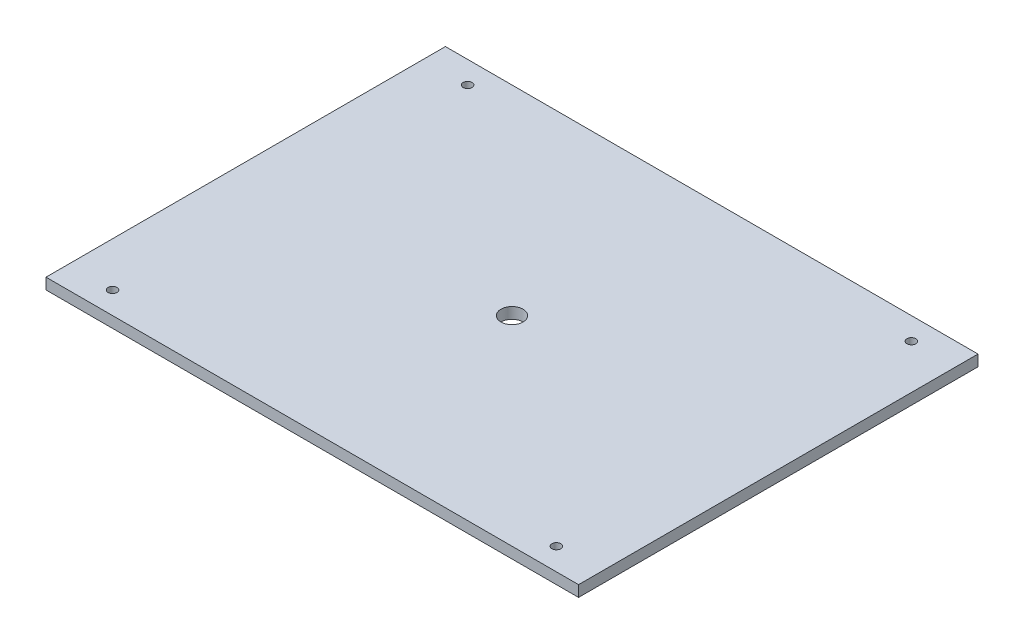
ISO-10303-21;
HEADER;
FILE_DESCRIPTION(('STEP AP214'),'2;1');
FILE_NAME('part.step','',(''),(''),'','','');
FILE_SCHEMA(('AUTOMOTIVE_DESIGN { 1 0 10303 214 1 1 1 1 }'));
ENDSEC;
DATA;
#1=APPLICATION_CONTEXT('core data for automotive mechanical design processes');
#2=APPLICATION_PROTOCOL_DEFINITION('international standard','automotive_design',2000,#1);
#3=PRODUCT_CONTEXT('',#1,'mechanical');
#4=PRODUCT('Part','Part','',(#3));
#5=PRODUCT_RELATED_PRODUCT_CATEGORY('part','',(#4));
#6=PRODUCT_DEFINITION_FORMATION('','',#4);
#7=PRODUCT_DEFINITION_CONTEXT('part definition',#1,'design');
#8=PRODUCT_DEFINITION('design','',#6,#7);
#9=PRODUCT_DEFINITION_SHAPE('','',#8);
#10=(LENGTH_UNIT() NAMED_UNIT(*) SI_UNIT(.MILLI.,.METRE.));
#11=(NAMED_UNIT(*) PLANE_ANGLE_UNIT() SI_UNIT($,.RADIAN.));
#12=(NAMED_UNIT(*) SI_UNIT($,.STERADIAN.) SOLID_ANGLE_UNIT());
#13=UNCERTAINTY_MEASURE_WITH_UNIT(LENGTH_MEASURE(1.E-05),#10,'distance_accuracy_value','');
#14=(GEOMETRIC_REPRESENTATION_CONTEXT(3) GLOBAL_UNCERTAINTY_ASSIGNED_CONTEXT((#13)) GLOBAL_UNIT_ASSIGNED_CONTEXT((#10,
#11,#12)) REPRESENTATION_CONTEXT('',''));
#15=CARTESIAN_POINT('',(0.,0.,0.));
#16=DIRECTION('',(0.,0.,1.));
#17=DIRECTION('',(1.,0.,0.));
#18=AXIS2_PLACEMENT_3D('',#15,#16,#17);
#19=CARTESIAN_POINT('',(0.,5.,0.));
#20=DIRECTION('',(0.,-1.,0.));
#21=DIRECTION('',(0.,0.,-1.));
#22=AXIS2_PLACEMENT_3D('',#19,#20,#21);
#23=PLANE('',#22);
#24=DIRECTION('',(0.,0.,-1.));
#25=VECTOR('',#24,1.);
#26=CARTESIAN_POINT('',(120.,5.,90.));
#27=LINE('',#26,#25);
#28=CARTESIAN_POINT('',(120.,5.,90.));
#29=VERTEX_POINT('',#28);
#30=CARTESIAN_POINT('',(120.,5.,-90.));
#31=VERTEX_POINT('',#30);
#32=EDGE_CURVE('E92',#29,#31,#27,.T.);
#33=ORIENTED_EDGE('',*,*,#32,.T.);
#34=DIRECTION('',(-1.,0.,0.));
#35=VECTOR('',#34,1.);
#36=CARTESIAN_POINT('',(-120.,5.,-90.));
#37=LINE('',#36,#35);
#38=CARTESIAN_POINT('',(-120.,5.,-90.));
#39=VERTEX_POINT('',#38);
#40=EDGE_CURVE('E87',#31,#39,#37,.T.);
#41=ORIENTED_EDGE('',*,*,#40,.T.);
#42=DIRECTION('',(0.,0.,1.));
#43=VECTOR('',#42,1.);
#44=CARTESIAN_POINT('',(-120.,5.,90.));
#45=LINE('',#44,#43);
#46=CARTESIAN_POINT('',(-120.,5.,90.));
#47=VERTEX_POINT('',#46);
#48=EDGE_CURVE('E90',#39,#47,#45,.T.);
#49=ORIENTED_EDGE('',*,*,#48,.T.);
#50=DIRECTION('',(1.,0.,0.));
#51=VECTOR('',#50,1.);
#52=CARTESIAN_POINT('',(-120.,5.,90.));
#53=LINE('',#52,#51);
#54=EDGE_CURVE('E57',#47,#29,#53,.T.);
#55=ORIENTED_EDGE('',*,*,#54,.T.);
#56=EDGE_LOOP('',(#33,#41,#49,#55));
#57=FACE_BOUND('',#56,.T.);
#58=CARTESIAN_POINT('',(-100.,5.,-80.));
#59=DIRECTION('',(0.,1.,0.));
#60=DIRECTION('',(0.,0.,1.));
#61=AXIS2_PLACEMENT_3D('',#58,#59,#60);
#62=CIRCLE('',#61,2.);
#63=CARTESIAN_POINT('',(-100.,5.,-78.));
#64=VERTEX_POINT('',#63);
#65=EDGE_CURVE('E107',#64,#64,#62,.T.);
#66=ORIENTED_EDGE('',*,*,#65,.F.);
#67=EDGE_LOOP('',(#66));
#68=FACE_BOUND('',#67,.T.);
#69=CARTESIAN_POINT('',(100.,5.,-80.));
#70=DIRECTION('',(0.,1.,0.));
#71=DIRECTION('',(0.,0.,1.));
#72=AXIS2_PLACEMENT_3D('',#69,#70,#71);
#73=CIRCLE('',#72,2.);
#74=CARTESIAN_POINT('',(100.,5.,-78.));
#75=VERTEX_POINT('',#74);
#76=EDGE_CURVE('E122',#75,#75,#73,.T.);
#77=ORIENTED_EDGE('',*,*,#76,.F.);
#78=EDGE_LOOP('',(#77));
#79=FACE_BOUND('',#78,.T.);
#80=CARTESIAN_POINT('',(100.,5.,80.));
#81=DIRECTION('',(0.,1.,0.));
#82=DIRECTION('',(0.,0.,1.));
#83=AXIS2_PLACEMENT_3D('',#80,#81,#82);
#84=CIRCLE('',#83,2.);
#85=CARTESIAN_POINT('',(100.,5.,82.));
#86=VERTEX_POINT('',#85);
#87=EDGE_CURVE('E128',#86,#86,#84,.T.);
#88=ORIENTED_EDGE('',*,*,#87,.F.);
#89=EDGE_LOOP('',(#88));
#90=FACE_BOUND('',#89,.T.);
#91=CARTESIAN_POINT('',(-100.,5.,80.));
#92=DIRECTION('',(0.,1.,0.));
#93=DIRECTION('',(0.,0.,1.));
#94=AXIS2_PLACEMENT_3D('',#91,#92,#93);
#95=CIRCLE('',#94,2.);
#96=CARTESIAN_POINT('',(-100.,5.,82.));
#97=VERTEX_POINT('',#96);
#98=EDGE_CURVE('E134',#97,#97,#95,.T.);
#99=ORIENTED_EDGE('',*,*,#98,.F.);
#100=EDGE_LOOP('',(#99));
#101=FACE_BOUND('',#100,.T.);
#102=CARTESIAN_POINT('',(0.,5.,0.));
#103=DIRECTION('',(0.,1.,0.));
#104=DIRECTION('',(0.,0.,1.));
#105=AXIS2_PLACEMENT_3D('',#102,#103,#104);
#106=CIRCLE('',#105,5.);
#107=CARTESIAN_POINT('',(0.,5.,5.));
#108=VERTEX_POINT('',#107);
#109=EDGE_CURVE('E140',#108,#108,#106,.T.);
#110=ORIENTED_EDGE('',*,*,#109,.F.);
#111=EDGE_LOOP('',(#110));
#112=FACE_BOUND('',#111,.T.);
#113=ADVANCED_FACE('F40',(#57,#68,#79,#90,#101,#112),#23,.F.);
#114=CARTESIAN_POINT('',(0.,0.,0.));
#115=DIRECTION('',(0.,-1.,0.));
#116=DIRECTION('',(0.,0.,-1.));
#117=AXIS2_PLACEMENT_3D('',#114,#115,#116);
#118=PLANE('',#117);
#119=CARTESIAN_POINT('',(-100.,0.,80.));
#120=DIRECTION('',(0.,1.,0.));
#121=DIRECTION('',(0.,0.,1.));
#122=AXIS2_PLACEMENT_3D('',#119,#120,#121);
#123=CIRCLE('',#122,2.);
#124=CARTESIAN_POINT('',(-100.,0.,82.));
#125=VERTEX_POINT('',#124);
#126=EDGE_CURVE('E137',#125,#125,#123,.T.);
#127=ORIENTED_EDGE('',*,*,#126,.T.);
#128=EDGE_LOOP('',(#127));
#129=FACE_BOUND('',#128,.T.);
#130=CARTESIAN_POINT('',(100.,0.,-80.));
#131=DIRECTION('',(0.,1.,0.));
#132=DIRECTION('',(0.,0.,1.));
#133=AXIS2_PLACEMENT_3D('',#130,#131,#132);
#134=CIRCLE('',#133,2.);
#135=CARTESIAN_POINT('',(100.,0.,-78.));
#136=VERTEX_POINT('',#135);
#137=EDGE_CURVE('E125',#136,#136,#134,.T.);
#138=ORIENTED_EDGE('',*,*,#137,.T.);
#139=EDGE_LOOP('',(#138));
#140=FACE_BOUND('',#139,.T.);
#141=DIRECTION('',(0.,0.,-1.));
#142=VECTOR('',#141,1.);
#143=CARTESIAN_POINT('',(120.,0.,90.));
#144=LINE('',#143,#142);
#145=CARTESIAN_POINT('',(120.,0.,90.));
#146=VERTEX_POINT('',#145);
#147=CARTESIAN_POINT('',(120.,0.,-90.));
#148=VERTEX_POINT('',#147);
#149=EDGE_CURVE('E104',#146,#148,#144,.T.);
#150=ORIENTED_EDGE('',*,*,#149,.F.);
#151=DIRECTION('',(1.,0.,0.));
#152=VECTOR('',#151,1.);
#153=CARTESIAN_POINT('',(-120.,0.,90.));
#154=LINE('',#153,#152);
#155=CARTESIAN_POINT('',(-120.,0.,90.));
#156=VERTEX_POINT('',#155);
#157=EDGE_CURVE('E80',#156,#146,#154,.T.);
#158=ORIENTED_EDGE('',*,*,#157,.F.);
#159=DIRECTION('',(0.,0.,1.));
#160=VECTOR('',#159,1.);
#161=CARTESIAN_POINT('',(-120.,0.,90.));
#162=LINE('',#161,#160);
#163=CARTESIAN_POINT('',(-120.,0.,-90.));
#164=VERTEX_POINT('',#163);
#165=EDGE_CURVE('E74',#164,#156,#162,.T.);
#166=ORIENTED_EDGE('',*,*,#165,.F.);
#167=DIRECTION('',(-1.,0.,0.));
#168=VECTOR('',#167,1.);
#169=CARTESIAN_POINT('',(-120.,0.,-90.));
#170=LINE('',#169,#168);
#171=EDGE_CURVE('E96',#148,#164,#170,.T.);
#172=ORIENTED_EDGE('',*,*,#171,.F.);
#173=EDGE_LOOP('',(#150,#158,#166,#172));
#174=FACE_BOUND('',#173,.T.);
#175=CARTESIAN_POINT('',(-100.,0.,-80.));
#176=DIRECTION('',(0.,1.,0.));
#177=DIRECTION('',(0.,0.,1.));
#178=AXIS2_PLACEMENT_3D('',#175,#176,#177);
#179=CIRCLE('',#178,2.);
#180=CARTESIAN_POINT('',(-100.,0.,-78.));
#181=VERTEX_POINT('',#180);
#182=EDGE_CURVE('E119',#181,#181,#179,.T.);
#183=ORIENTED_EDGE('',*,*,#182,.T.);
#184=EDGE_LOOP('',(#183));
#185=FACE_BOUND('',#184,.T.);
#186=CARTESIAN_POINT('',(100.,0.,80.));
#187=DIRECTION('',(0.,1.,0.));
#188=DIRECTION('',(0.,0.,1.));
#189=AXIS2_PLACEMENT_3D('',#186,#187,#188);
#190=CIRCLE('',#189,2.);
#191=CARTESIAN_POINT('',(100.,0.,82.));
#192=VERTEX_POINT('',#191);
#193=EDGE_CURVE('E131',#192,#192,#190,.T.);
#194=ORIENTED_EDGE('',*,*,#193,.T.);
#195=EDGE_LOOP('',(#194));
#196=FACE_BOUND('',#195,.T.);
#197=CARTESIAN_POINT('',(0.,0.,0.));
#198=DIRECTION('',(0.,1.,0.));
#199=DIRECTION('',(0.,0.,1.));
#200=AXIS2_PLACEMENT_3D('',#197,#198,#199);
#201=CIRCLE('',#200,5.);
#202=CARTESIAN_POINT('',(0.,0.,5.));
#203=VERTEX_POINT('',#202);
#204=EDGE_CURVE('E143',#203,#203,#201,.T.);
#205=ORIENTED_EDGE('',*,*,#204,.T.);
#206=EDGE_LOOP('',(#205));
#207=FACE_BOUND('',#206,.T.);
#208=ADVANCED_FACE('F115',(#129,#140,#174,#185,#196,#207),#118,.T.);
#209=CARTESIAN_POINT('',(120.,5.,90.));
#210=DIRECTION('',(-1.,0.,0.));
#211=DIRECTION('',(0.,0.,1.));
#212=AXIS2_PLACEMENT_3D('',#209,#210,#211);
#213=PLANE('',#212);
#214=ORIENTED_EDGE('',*,*,#149,.T.);
#215=DIRECTION('',(0.,-1.,0.));
#216=VECTOR('',#215,1.);
#217=CARTESIAN_POINT('',(120.,5.,-90.));
#218=LINE('',#217,#216);
#219=EDGE_CURVE('E11',#31,#148,#218,.T.);
#220=ORIENTED_EDGE('',*,*,#219,.F.);
#221=ORIENTED_EDGE('',*,*,#32,.F.);
#222=DIRECTION('',(0.,-1.,0.));
#223=VECTOR('',#222,1.);
#224=CARTESIAN_POINT('',(120.,5.,90.));
#225=LINE('',#224,#223);
#226=EDGE_CURVE('E100',#29,#146,#225,.T.);
#227=ORIENTED_EDGE('',*,*,#226,.T.);
#228=EDGE_LOOP('',(#214,#220,#221,#227));
#229=FACE_BOUND('',#228,.T.);
#230=ADVANCED_FACE('F42',(#229),#213,.F.);
#231=CARTESIAN_POINT('',(-120.,5.,-90.));
#232=DIRECTION('',(0.,0.,1.));
#233=DIRECTION('',(1.,0.,0.));
#234=AXIS2_PLACEMENT_3D('',#231,#232,#233);
#235=PLANE('',#234);
#236=ORIENTED_EDGE('',*,*,#171,.T.);
#237=DIRECTION('',(0.,-1.,0.));
#238=VECTOR('',#237,1.);
#239=CARTESIAN_POINT('',(-120.,5.,-90.));
#240=LINE('',#239,#238);
#241=EDGE_CURVE('E49',#39,#164,#240,.T.);
#242=ORIENTED_EDGE('',*,*,#241,.F.);
#243=ORIENTED_EDGE('',*,*,#40,.F.);
#244=ORIENTED_EDGE('',*,*,#219,.T.);
#245=EDGE_LOOP('',(#236,#242,#243,#244));
#246=FACE_BOUND('',#245,.T.);
#247=ADVANCED_FACE('F95',(#246),#235,.F.);
#248=CARTESIAN_POINT('',(-120.,5.,90.));
#249=DIRECTION('',(1.,0.,0.));
#250=DIRECTION('',(0.,0.,-1.));
#251=AXIS2_PLACEMENT_3D('',#248,#249,#250);
#252=PLANE('',#251);
#253=ORIENTED_EDGE('',*,*,#165,.T.);
#254=DIRECTION('',(0.,-1.,0.));
#255=VECTOR('',#254,1.);
#256=CARTESIAN_POINT('',(-120.,5.,90.));
#257=LINE('',#256,#255);
#258=EDGE_CURVE('E97',#47,#156,#257,.T.);
#259=ORIENTED_EDGE('',*,*,#258,.F.);
#260=ORIENTED_EDGE('',*,*,#48,.F.);
#261=ORIENTED_EDGE('',*,*,#241,.T.);
#262=EDGE_LOOP('',(#253,#259,#260,#261));
#263=FACE_BOUND('',#262,.T.);
#264=ADVANCED_FACE('F98',(#263),#252,.F.);
#265=CARTESIAN_POINT('',(-120.,5.,90.));
#266=DIRECTION('',(0.,0.,-1.));
#267=DIRECTION('',(-1.,0.,0.));
#268=AXIS2_PLACEMENT_3D('',#265,#266,#267);
#269=PLANE('',#268);
#270=ORIENTED_EDGE('',*,*,#157,.T.);
#271=ORIENTED_EDGE('',*,*,#226,.F.);
#272=ORIENTED_EDGE('',*,*,#54,.F.);
#273=ORIENTED_EDGE('',*,*,#258,.T.);
#274=EDGE_LOOP('',(#270,#271,#272,#273));
#275=FACE_BOUND('',#274,.T.);
#276=ADVANCED_FACE('F112',(#275),#269,.F.);
#277=CARTESIAN_POINT('',(-100.,5.,-80.));
#278=DIRECTION('',(0.,-1.,0.));
#279=DIRECTION('',(0.,0.,-1.));
#280=AXIS2_PLACEMENT_3D('',#277,#278,#279);
#281=CYLINDRICAL_SURFACE('',#280,2.);
#282=ORIENTED_EDGE('',*,*,#65,.T.);
#283=EDGE_LOOP('',(#282));
#284=FACE_BOUND('',#283,.T.);
#285=ORIENTED_EDGE('',*,*,#182,.F.);
#286=EDGE_LOOP('',(#285));
#287=FACE_BOUND('',#286,.T.);
#288=ADVANCED_FACE('F160',(#284,#287),#281,.F.);
#289=CARTESIAN_POINT('',(100.,5.,-80.));
#290=DIRECTION('',(0.,-1.,0.));
#291=DIRECTION('',(0.,0.,-1.));
#292=AXIS2_PLACEMENT_3D('',#289,#290,#291);
#293=CYLINDRICAL_SURFACE('',#292,2.);
#294=ORIENTED_EDGE('',*,*,#76,.T.);
#295=EDGE_LOOP('',(#294));
#296=FACE_BOUND('',#295,.T.);
#297=ORIENTED_EDGE('',*,*,#137,.F.);
#298=EDGE_LOOP('',(#297));
#299=FACE_BOUND('',#298,.T.);
#300=ADVANCED_FACE('F214',(#296,#299),#293,.F.);
#301=CARTESIAN_POINT('',(100.,5.,80.));
#302=DIRECTION('',(0.,-1.,0.));
#303=DIRECTION('',(0.,0.,-1.));
#304=AXIS2_PLACEMENT_3D('',#301,#302,#303);
#305=CYLINDRICAL_SURFACE('',#304,2.);
#306=ORIENTED_EDGE('',*,*,#87,.T.);
#307=EDGE_LOOP('',(#306));
#308=FACE_BOUND('',#307,.T.);
#309=ORIENTED_EDGE('',*,*,#193,.F.);
#310=EDGE_LOOP('',(#309));
#311=FACE_BOUND('',#310,.T.);
#312=ADVANCED_FACE('F223',(#308,#311),#305,.F.);
#313=CARTESIAN_POINT('',(-100.,5.,80.));
#314=DIRECTION('',(0.,-1.,0.));
#315=DIRECTION('',(0.,0.,-1.));
#316=AXIS2_PLACEMENT_3D('',#313,#314,#315);
#317=CYLINDRICAL_SURFACE('',#316,2.);
#318=ORIENTED_EDGE('',*,*,#98,.T.);
#319=EDGE_LOOP('',(#318));
#320=FACE_BOUND('',#319,.T.);
#321=ORIENTED_EDGE('',*,*,#126,.F.);
#322=EDGE_LOOP('',(#321));
#323=FACE_BOUND('',#322,.T.);
#324=ADVANCED_FACE('F232',(#320,#323),#317,.F.);
#325=CARTESIAN_POINT('',(0.,5.,0.));
#326=DIRECTION('',(0.,-1.,0.));
#327=DIRECTION('',(0.,0.,-1.));
#328=AXIS2_PLACEMENT_3D('',#325,#326,#327);
#329=CYLINDRICAL_SURFACE('',#328,5.);
#330=ORIENTED_EDGE('',*,*,#109,.T.);
#331=EDGE_LOOP('',(#330));
#332=FACE_BOUND('',#331,.T.);
#333=ORIENTED_EDGE('',*,*,#204,.F.);
#334=EDGE_LOOP('',(#333));
#335=FACE_BOUND('',#334,.T.);
#336=ADVANCED_FACE('F149',(#332,#335),#329,.F.);
#337=CLOSED_SHELL('',(#113,#208,#230,#247,#264,#276,#288,#300,#312,#324,#336));
#338=MANIFOLD_SOLID_BREP('B2',#337);
#339=ADVANCED_BREP_SHAPE_REPRESENTATION('',(#18,#338),#14);
#340=SHAPE_DEFINITION_REPRESENTATION(#9,#339);
ENDSEC;
END-ISO-10303-21;
